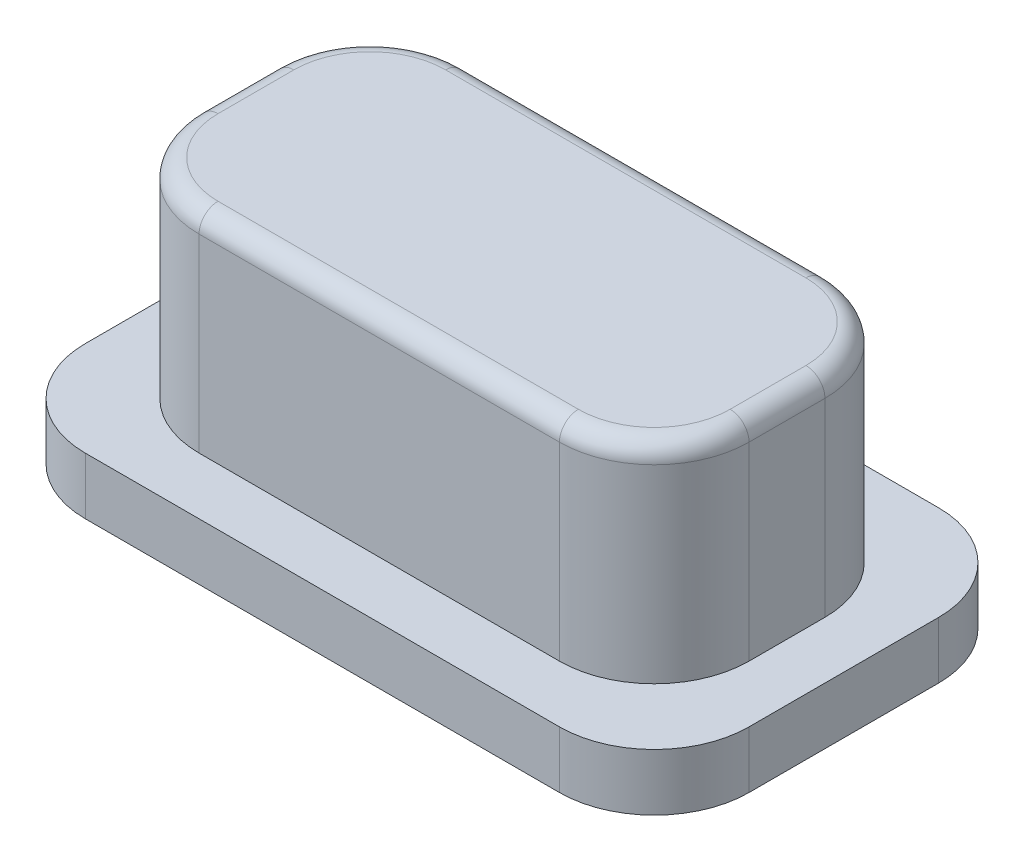
ISO-10303-21;
HEADER;
FILE_DESCRIPTION(('STEP AP214'),'2;1');
FILE_NAME('part.step','',(''),(''),'','','');
FILE_SCHEMA(('AUTOMOTIVE_DESIGN { 1 0 10303 214 1 1 1 1 }'));
ENDSEC;
DATA;
#1=APPLICATION_CONTEXT('core data for automotive mechanical design processes');
#2=APPLICATION_PROTOCOL_DEFINITION('international standard','automotive_design',2000,#1);
#3=PRODUCT_CONTEXT('',#1,'mechanical');
#4=PRODUCT('Part','Part','',(#3));
#5=PRODUCT_RELATED_PRODUCT_CATEGORY('part','',(#4));
#6=PRODUCT_DEFINITION_FORMATION('','',#4);
#7=PRODUCT_DEFINITION_CONTEXT('part definition',#1,'design');
#8=PRODUCT_DEFINITION('design','',#6,#7);
#9=PRODUCT_DEFINITION_SHAPE('','',#8);
#10=(LENGTH_UNIT() NAMED_UNIT(*) SI_UNIT(.MILLI.,.METRE.));
#11=(NAMED_UNIT(*) PLANE_ANGLE_UNIT() SI_UNIT($,.RADIAN.));
#12=(NAMED_UNIT(*) SI_UNIT($,.STERADIAN.) SOLID_ANGLE_UNIT());
#13=UNCERTAINTY_MEASURE_WITH_UNIT(LENGTH_MEASURE(1.E-05),#10,'distance_accuracy_value','');
#14=(GEOMETRIC_REPRESENTATION_CONTEXT(3) GLOBAL_UNCERTAINTY_ASSIGNED_CONTEXT((#13)) GLOBAL_UNIT_ASSIGNED_CONTEXT((#10,
#11,#12)) REPRESENTATION_CONTEXT('',''));
#15=CARTESIAN_POINT('',(0.,0.,0.));
#16=DIRECTION('',(0.,0.,1.));
#17=DIRECTION('',(1.,0.,0.));
#18=AXIS2_PLACEMENT_3D('',#15,#16,#17);
#19=CARTESIAN_POINT('',(0.,0.,0.));
#20=DIRECTION('',(0.,1.,0.));
#21=DIRECTION('',(0.,0.,1.));
#22=AXIS2_PLACEMENT_3D('',#19,#20,#21);
#23=PLANE('',#22);
#24=DIRECTION('',(-1.,0.,0.));
#25=VECTOR('',#24,1.);
#26=CARTESIAN_POINT('',(-2.50310695575245,0.,-1.76035479309902));
#27=LINE('',#26,#25);
#28=CARTESIAN_POINT('',(3.49689304424755,0.,-1.76035479309902));
#29=VERTEX_POINT('',#28);
#30=CARTESIAN_POINT('',(-1.50310695575245,0.,-1.76035479309902));
#31=VERTEX_POINT('',#30);
#32=EDGE_CURVE('E244',#29,#31,#27,.T.);
#33=ORIENTED_EDGE('',*,*,#32,.F.);
#34=CARTESIAN_POINT('',(3.49689304424755,0.,-0.760354793099017));
#35=DIRECTION('',(0.,1.,0.));
#36=DIRECTION('',(0.,0.,1.));
#37=AXIS2_PLACEMENT_3D('',#34,#35,#36);
#38=CIRCLE('',#37,1.);
#39=CARTESIAN_POINT('',(4.49689304424755,0.,-0.760354793099017));
#40=VERTEX_POINT('',#39);
#41=EDGE_CURVE('E274',#29,#40,#38,.F.);
#42=ORIENTED_EDGE('',*,*,#41,.T.);
#43=DIRECTION('',(0.,0.,-1.));
#44=VECTOR('',#43,1.);
#45=CARTESIAN_POINT('',(4.49689304424755,0.,-1.76035479309902));
#46=LINE('',#45,#44);
#47=CARTESIAN_POINT('',(4.49689304424755,0.,1.23964520690098));
#48=VERTEX_POINT('',#47);
#49=EDGE_CURVE('E259',#48,#40,#46,.T.);
#50=ORIENTED_EDGE('',*,*,#49,.F.);
#51=CARTESIAN_POINT('',(3.49689304424755,0.,1.23964520690098));
#52=DIRECTION('',(0.,1.,0.));
#53=DIRECTION('',(0.,0.,1.));
#54=AXIS2_PLACEMENT_3D('',#51,#52,#53);
#55=CIRCLE('',#54,1.);
#56=CARTESIAN_POINT('',(3.49689304424755,0.,2.23964520690098));
#57=VERTEX_POINT('',#56);
#58=EDGE_CURVE('E272',#48,#57,#55,.F.);
#59=ORIENTED_EDGE('',*,*,#58,.T.);
#60=DIRECTION('',(1.,0.,0.));
#61=VECTOR('',#60,1.);
#62=CARTESIAN_POINT('',(-2.50310695575245,0.,2.23964520690098));
#63=LINE('',#62,#61);
#64=CARTESIAN_POINT('',(-1.50310695575245,0.,2.23964520690098));
#65=VERTEX_POINT('',#64);
#66=EDGE_CURVE('E256',#65,#57,#63,.T.);
#67=ORIENTED_EDGE('',*,*,#66,.F.);
#68=CARTESIAN_POINT('',(-1.50310695575245,0.,1.23964520690098));
#69=DIRECTION('',(0.,1.,0.));
#70=DIRECTION('',(0.,0.,1.));
#71=AXIS2_PLACEMENT_3D('',#68,#69,#70);
#72=CIRCLE('',#71,1.);
#73=CARTESIAN_POINT('',(-2.50310695575245,0.,1.23964520690098));
#74=VERTEX_POINT('',#73);
#75=EDGE_CURVE('E268',#65,#74,#72,.F.);
#76=ORIENTED_EDGE('',*,*,#75,.T.);
#77=DIRECTION('',(0.,0.,1.));
#78=VECTOR('',#77,1.);
#79=CARTESIAN_POINT('',(-2.50310695575245,0.,-1.76035479309902));
#80=LINE('',#79,#78);
#81=CARTESIAN_POINT('',(-2.50310695575245,0.,-0.760354793099017));
#82=VERTEX_POINT('',#81);
#83=EDGE_CURVE('E239',#82,#74,#80,.T.);
#84=ORIENTED_EDGE('',*,*,#83,.F.);
#85=CARTESIAN_POINT('',(-1.50310695575245,0.,-0.760354793099017));
#86=DIRECTION('',(0.,1.,0.));
#87=DIRECTION('',(0.,0.,1.));
#88=AXIS2_PLACEMENT_3D('',#85,#86,#87);
#89=CIRCLE('',#88,1.);
#90=EDGE_CURVE('E270',#82,#31,#89,.F.);
#91=ORIENTED_EDGE('',*,*,#90,.T.);
#92=EDGE_LOOP('',(#33,#42,#50,#59,#67,#76,#84,#91));
#93=FACE_BOUND('',#92,.T.);
#94=DIRECTION('',(0.,0.,-1.));
#95=VECTOR('',#94,1.);
#96=CARTESIAN_POINT('',(-0.503106955752448,0.,-0.560354793099017));
#97=LINE('',#96,#95);
#98=CARTESIAN_POINT('',(-0.503106955752449,0.,1.03964520690098));
#99=VERTEX_POINT('',#98);
#100=CARTESIAN_POINT('',(-0.503106955752448,0.,-0.560354793099017));
#101=VERTEX_POINT('',#100);
#102=EDGE_CURVE('E221',#99,#101,#97,.T.);
#103=ORIENTED_EDGE('',*,*,#102,.F.);
#104=DIRECTION('',(-1.,0.,0.));
#105=VECTOR('',#104,1.);
#106=CARTESIAN_POINT('',(2.49689304424755,0.,1.03964520690098));
#107=LINE('',#106,#105);
#108=CARTESIAN_POINT('',(2.49689304424755,0.,1.03964520690098));
#109=VERTEX_POINT('',#108);
#110=EDGE_CURVE('E218',#109,#99,#107,.T.);
#111=ORIENTED_EDGE('',*,*,#110,.F.);
#112=DIRECTION('',(0.,0.,1.));
#113=VECTOR('',#112,1.);
#114=CARTESIAN_POINT('',(2.49689304424755,0.,-0.560354793099017));
#115=LINE('',#114,#113);
#116=CARTESIAN_POINT('',(2.49689304424755,0.,-0.560354793099017));
#117=VERTEX_POINT('',#116);
#118=EDGE_CURVE('E382',#117,#109,#115,.T.);
#119=ORIENTED_EDGE('',*,*,#118,.F.);
#120=DIRECTION('',(1.,0.,0.));
#121=VECTOR('',#120,1.);
#122=CARTESIAN_POINT('',(2.49689304424755,0.,-0.560354793099017));
#123=LINE('',#122,#121);
#124=EDGE_CURVE('E380',#101,#117,#123,.T.);
#125=ORIENTED_EDGE('',*,*,#124,.F.);
#126=EDGE_LOOP('',(#103,#111,#119,#125));
#127=FACE_BOUND('',#126,.T.);
#128=ADVANCED_FACE('F34',(#93,#127),#23,.F.);
#129=CARTESIAN_POINT('',(-2.50310695575245,0.6,-1.76035479309902));
#130=DIRECTION('',(1.,0.,0.));
#131=DIRECTION('',(0.,0.,-1.));
#132=AXIS2_PLACEMENT_3D('',#129,#130,#131);
#133=PLANE('',#132);
#134=DIRECTION('',(0.,0.,1.));
#135=VECTOR('',#134,1.);
#136=CARTESIAN_POINT('',(-2.50310695575245,0.6,-1.76035479309902));
#137=LINE('',#136,#135);
#138=CARTESIAN_POINT('',(-2.50310695575245,0.6,-0.760354793099017));
#139=VERTEX_POINT('',#138);
#140=CARTESIAN_POINT('',(-2.50310695575245,0.6,1.23964520690098));
#141=VERTEX_POINT('',#140);
#142=EDGE_CURVE('E240',#139,#141,#137,.T.);
#143=ORIENTED_EDGE('',*,*,#142,.F.);
#144=DIRECTION('',(0.,-1.,0.));
#145=VECTOR('',#144,1.);
#146=CARTESIAN_POINT('',(-2.50310695575245,0.6,-0.760354793099017));
#147=LINE('',#146,#145);
#148=EDGE_CURVE('E296',#139,#82,#147,.T.);
#149=ORIENTED_EDGE('',*,*,#148,.T.);
#150=ORIENTED_EDGE('',*,*,#83,.T.);
#151=DIRECTION('',(0.,-1.,0.));
#152=VECTOR('',#151,1.);
#153=CARTESIAN_POINT('',(-2.50310695575245,0.6,1.23964520690098));
#154=LINE('',#153,#152);
#155=EDGE_CURVE('E294',#74,#141,#154,.F.);
#156=ORIENTED_EDGE('',*,*,#155,.T.);
#157=EDGE_LOOP('',(#143,#149,#150,#156));
#158=FACE_BOUND('',#157,.T.);
#159=ADVANCED_FACE('F400',(#158),#133,.F.);
#160=CARTESIAN_POINT('',(-2.50310695575245,0.6,2.23964520690098));
#161=DIRECTION('',(0.,0.,-1.));
#162=DIRECTION('',(-1.,0.,0.));
#163=AXIS2_PLACEMENT_3D('',#160,#161,#162);
#164=PLANE('',#163);
#165=ORIENTED_EDGE('',*,*,#66,.T.);
#166=DIRECTION('',(0.,-1.,0.));
#167=VECTOR('',#166,1.);
#168=CARTESIAN_POINT('',(3.49689304424755,0.6,2.23964520690098));
#169=LINE('',#168,#167);
#170=CARTESIAN_POINT('',(3.49689304424755,0.6,2.23964520690098));
#171=VERTEX_POINT('',#170);
#172=EDGE_CURVE('E292',#57,#171,#169,.F.);
#173=ORIENTED_EDGE('',*,*,#172,.T.);
#174=DIRECTION('',(1.,0.,0.));
#175=VECTOR('',#174,1.);
#176=CARTESIAN_POINT('',(-2.50310695575245,0.6,2.23964520690098));
#177=LINE('',#176,#175);
#178=CARTESIAN_POINT('',(-1.50310695575245,0.6,2.23964520690098));
#179=VERTEX_POINT('',#178);
#180=EDGE_CURVE('E243',#179,#171,#177,.T.);
#181=ORIENTED_EDGE('',*,*,#180,.F.);
#182=DIRECTION('',(0.,-1.,0.));
#183=VECTOR('',#182,1.);
#184=CARTESIAN_POINT('',(-1.50310695575245,0.6,2.23964520690098));
#185=LINE('',#184,#183);
#186=EDGE_CURVE('E289',#179,#65,#185,.T.);
#187=ORIENTED_EDGE('',*,*,#186,.T.);
#188=EDGE_LOOP('',(#165,#173,#181,#187));
#189=FACE_BOUND('',#188,.T.);
#190=ADVANCED_FACE('F406',(#189),#164,.F.);
#191=CARTESIAN_POINT('',(4.49689304424755,0.6,-1.76035479309902));
#192=DIRECTION('',(-1.,0.,0.));
#193=DIRECTION('',(0.,0.,1.));
#194=AXIS2_PLACEMENT_3D('',#191,#192,#193);
#195=PLANE('',#194);
#196=ORIENTED_EDGE('',*,*,#49,.T.);
#197=DIRECTION('',(0.,-1.,0.));
#198=VECTOR('',#197,1.);
#199=CARTESIAN_POINT('',(4.49689304424755,0.6,-0.760354793099017));
#200=LINE('',#199,#198);
#201=CARTESIAN_POINT('',(4.49689304424755,0.6,-0.760354793099017));
#202=VERTEX_POINT('',#201);
#203=EDGE_CURVE('E279',#40,#202,#200,.F.);
#204=ORIENTED_EDGE('',*,*,#203,.T.);
#205=DIRECTION('',(0.,0.,-1.));
#206=VECTOR('',#205,1.);
#207=CARTESIAN_POINT('',(4.49689304424755,0.6,-1.76035479309902));
#208=LINE('',#207,#206);
#209=CARTESIAN_POINT('',(4.49689304424755,0.6,1.23964520690098));
#210=VERTEX_POINT('',#209);
#211=EDGE_CURVE('E247',#210,#202,#208,.T.);
#212=ORIENTED_EDGE('',*,*,#211,.F.);
#213=DIRECTION('',(0.,-1.,0.));
#214=VECTOR('',#213,1.);
#215=CARTESIAN_POINT('',(4.49689304424755,0.6,1.23964520690098));
#216=LINE('',#215,#214);
#217=EDGE_CURVE('E276',#210,#48,#216,.T.);
#218=ORIENTED_EDGE('',*,*,#217,.T.);
#219=EDGE_LOOP('',(#196,#204,#212,#218));
#220=FACE_BOUND('',#219,.T.);
#221=ADVANCED_FACE('F417',(#220),#195,.F.);
#222=CARTESIAN_POINT('',(-2.50310695575245,0.6,-1.76035479309902));
#223=DIRECTION('',(0.,0.,1.));
#224=DIRECTION('',(1.,0.,0.));
#225=AXIS2_PLACEMENT_3D('',#222,#223,#224);
#226=PLANE('',#225);
#227=DIRECTION('',(-1.,0.,0.));
#228=VECTOR('',#227,1.);
#229=CARTESIAN_POINT('',(-2.50310695575245,0.6,-1.76035479309902));
#230=LINE('',#229,#228);
#231=CARTESIAN_POINT('',(3.49689304424755,0.6,-1.76035479309902));
#232=VERTEX_POINT('',#231);
#233=CARTESIAN_POINT('',(-1.50310695575245,0.6,-1.76035479309902));
#234=VERTEX_POINT('',#233);
#235=EDGE_CURVE('E250',#232,#234,#230,.T.);
#236=ORIENTED_EDGE('',*,*,#235,.F.);
#237=DIRECTION('',(0.,-1.,0.));
#238=VECTOR('',#237,1.);
#239=CARTESIAN_POINT('',(3.49689304424755,0.6,-1.76035479309902));
#240=LINE('',#239,#238);
#241=EDGE_CURVE('E265',#232,#29,#240,.T.);
#242=ORIENTED_EDGE('',*,*,#241,.T.);
#243=ORIENTED_EDGE('',*,*,#32,.T.);
#244=DIRECTION('',(0.,-1.,0.));
#245=VECTOR('',#244,1.);
#246=CARTESIAN_POINT('',(-1.50310695575245,0.6,-1.76035479309902));
#247=LINE('',#246,#245);
#248=EDGE_CURVE('E253',#31,#234,#247,.F.);
#249=ORIENTED_EDGE('',*,*,#248,.T.);
#250=EDGE_LOOP('',(#236,#242,#243,#249));
#251=FACE_BOUND('',#250,.T.);
#252=ADVANCED_FACE('F414',(#251),#226,.F.);
#253=CARTESIAN_POINT('',(0.,0.6,0.));
#254=DIRECTION('',(0.,1.,0.));
#255=DIRECTION('',(0.,0.,1.));
#256=AXIS2_PLACEMENT_3D('',#253,#254,#255);
#257=PLANE('',#256);
#258=DIRECTION('',(0.,0.,-1.));
#259=VECTOR('',#258,1.);
#260=CARTESIAN_POINT('',(3.89689304424755,0.6,-1.16035479309902));
#261=LINE('',#260,#259);
#262=CARTESIAN_POINT('',(3.89689304424755,0.6,0.639645206900983));
#263=VERTEX_POINT('',#262);
#264=CARTESIAN_POINT('',(3.89689304424755,0.6,-0.160354793099017));
#265=VERTEX_POINT('',#264);
#266=EDGE_CURVE('E222',#263,#265,#261,.T.);
#267=ORIENTED_EDGE('',*,*,#266,.F.);
#268=CARTESIAN_POINT('',(2.89689304424755,0.6,0.639645206900983));
#269=DIRECTION('',(0.,1.,0.));
#270=DIRECTION('',(0.,0.,1.));
#271=AXIS2_PLACEMENT_3D('',#268,#269,#270);
#272=CIRCLE('',#271,1.);
#273=CARTESIAN_POINT('',(2.89689304424755,0.6,1.63964520690098));
#274=VERTEX_POINT('',#273);
#275=EDGE_CURVE('E323',#263,#274,#272,.F.);
#276=ORIENTED_EDGE('',*,*,#275,.T.);
#277=DIRECTION('',(1.,0.,0.));
#278=VECTOR('',#277,1.);
#279=CARTESIAN_POINT('',(-1.90310695575245,0.6,1.63964520690098));
#280=LINE('',#279,#278);
#281=CARTESIAN_POINT('',(-0.903106955752448,0.6,1.63964520690098));
#282=VERTEX_POINT('',#281);
#283=EDGE_CURVE('E236',#282,#274,#280,.T.);
#284=ORIENTED_EDGE('',*,*,#283,.F.);
#285=CARTESIAN_POINT('',(-0.903106955752448,0.6,0.639645206900983));
#286=DIRECTION('',(0.,1.,0.));
#287=DIRECTION('',(0.,0.,1.));
#288=AXIS2_PLACEMENT_3D('',#285,#286,#287);
#289=CIRCLE('',#288,1.);
#290=CARTESIAN_POINT('',(-1.90310695575245,0.6,0.639645206900983));
#291=VERTEX_POINT('',#290);
#292=EDGE_CURVE('E321',#282,#291,#289,.F.);
#293=ORIENTED_EDGE('',*,*,#292,.T.);
#294=DIRECTION('',(0.,0.,1.));
#295=VECTOR('',#294,1.);
#296=CARTESIAN_POINT('',(-1.90310695575245,0.6,-1.16035479309902));
#297=LINE('',#296,#295);
#298=CARTESIAN_POINT('',(-1.90310695575245,0.6,-0.160354793099017));
#299=VERTEX_POINT('',#298);
#300=EDGE_CURVE('E233',#299,#291,#297,.T.);
#301=ORIENTED_EDGE('',*,*,#300,.F.);
#302=CARTESIAN_POINT('',(-0.903106955752448,0.6,-0.160354793099017));
#303=DIRECTION('',(0.,1.,0.));
#304=DIRECTION('',(0.,0.,1.));
#305=AXIS2_PLACEMENT_3D('',#302,#303,#304);
#306=CIRCLE('',#305,1.);
#307=CARTESIAN_POINT('',(-0.903106955752448,0.6,-1.16035479309902));
#308=VERTEX_POINT('',#307);
#309=EDGE_CURVE('E319',#299,#308,#306,.F.);
#310=ORIENTED_EDGE('',*,*,#309,.T.);
#311=DIRECTION('',(-1.,0.,0.));
#312=VECTOR('',#311,1.);
#313=CARTESIAN_POINT('',(-1.90310695575245,0.6,-1.16035479309902));
#314=LINE('',#313,#312);
#315=CARTESIAN_POINT('',(2.89689304424755,0.6,-1.16035479309902));
#316=VERTEX_POINT('',#315);
#317=EDGE_CURVE('E225',#316,#308,#314,.T.);
#318=ORIENTED_EDGE('',*,*,#317,.F.);
#319=CARTESIAN_POINT('',(2.89689304424755,0.6,-0.160354793099017));
#320=DIRECTION('',(0.,1.,0.));
#321=DIRECTION('',(0.,0.,1.));
#322=AXIS2_PLACEMENT_3D('',#319,#320,#321);
#323=CIRCLE('',#322,1.);
#324=EDGE_CURVE('E317',#316,#265,#323,.F.);
#325=ORIENTED_EDGE('',*,*,#324,.T.);
#326=EDGE_LOOP('',(#267,#276,#284,#293,#301,#310,#318,#325));
#327=FACE_BOUND('',#326,.T.);
#328=ORIENTED_EDGE('',*,*,#211,.T.);
#329=CARTESIAN_POINT('',(3.49689304424755,0.6,-0.760354793099017));
#330=DIRECTION('',(0.,1.,0.));
#331=DIRECTION('',(0.,0.,1.));
#332=AXIS2_PLACEMENT_3D('',#329,#330,#331);
#333=CIRCLE('',#332,1.);
#334=EDGE_CURVE('E287',#202,#232,#333,.T.);
#335=ORIENTED_EDGE('',*,*,#334,.T.);
#336=ORIENTED_EDGE('',*,*,#235,.T.);
#337=CARTESIAN_POINT('',(-1.50310695575245,0.6,-0.760354793099017));
#338=DIRECTION('',(0.,1.,0.));
#339=DIRECTION('',(0.,0.,1.));
#340=AXIS2_PLACEMENT_3D('',#337,#338,#339);
#341=CIRCLE('',#340,1.);
#342=EDGE_CURVE('E283',#234,#139,#341,.T.);
#343=ORIENTED_EDGE('',*,*,#342,.T.);
#344=ORIENTED_EDGE('',*,*,#142,.T.);
#345=CARTESIAN_POINT('',(-1.50310695575245,0.6,1.23964520690098));
#346=DIRECTION('',(0.,1.,0.));
#347=DIRECTION('',(0.,0.,1.));
#348=AXIS2_PLACEMENT_3D('',#345,#346,#347);
#349=CIRCLE('',#348,1.);
#350=EDGE_CURVE('E281',#141,#179,#349,.T.);
#351=ORIENTED_EDGE('',*,*,#350,.T.);
#352=ORIENTED_EDGE('',*,*,#180,.T.);
#353=CARTESIAN_POINT('',(3.49689304424755,0.6,1.23964520690098));
#354=DIRECTION('',(0.,1.,0.));
#355=DIRECTION('',(0.,0.,1.));
#356=AXIS2_PLACEMENT_3D('',#353,#354,#355);
#357=CIRCLE('',#356,1.);
#358=EDGE_CURVE('E285',#171,#210,#357,.T.);
#359=ORIENTED_EDGE('',*,*,#358,.T.);
#360=EDGE_LOOP('',(#328,#335,#336,#343,#344,#351,#352,#359));
#361=FACE_BOUND('',#360,.T.);
#362=ADVANCED_FACE('F412',(#327,#361),#257,.T.);
#363=CARTESIAN_POINT('',(3.89689304424755,2.8,-1.16035479309902));
#364=DIRECTION('',(-1.,0.,0.));
#365=DIRECTION('',(0.,0.,1.));
#366=AXIS2_PLACEMENT_3D('',#363,#364,#365);
#367=PLANE('',#366);
#368=DIRECTION('',(0.,-1.,0.));
#369=VECTOR('',#368,1.);
#370=CARTESIAN_POINT('',(3.89689304424755,2.8,-0.160354793099017));
#371=LINE('',#370,#369);
#372=CARTESIAN_POINT('',(3.89689304424755,2.6,-0.160354793099017));
#373=VERTEX_POINT('',#372);
#374=EDGE_CURVE('E305',#265,#373,#371,.F.);
#375=ORIENTED_EDGE('',*,*,#374,.T.);
#376=DIRECTION('',(0.,0.,-1.));
#377=VECTOR('',#376,1.);
#378=CARTESIAN_POINT('',(3.89689304424755,2.6,0.639645206900983));
#379=LINE('',#378,#377);
#380=CARTESIAN_POINT('',(3.89689304424755,2.6,0.639645206900983));
#381=VERTEX_POINT('',#380);
#382=EDGE_CURVE('E11',#373,#381,#379,.F.);
#383=ORIENTED_EDGE('',*,*,#382,.T.);
#384=DIRECTION('',(0.,-1.,0.));
#385=VECTOR('',#384,1.);
#386=CARTESIAN_POINT('',(3.89689304424755,2.8,0.639645206900983));
#387=LINE('',#386,#385);
#388=EDGE_CURVE('E303',#381,#263,#387,.T.);
#389=ORIENTED_EDGE('',*,*,#388,.T.);
#390=ORIENTED_EDGE('',*,*,#266,.T.);
#391=EDGE_LOOP('',(#375,#383,#389,#390));
#392=FACE_BOUND('',#391,.T.);
#393=ADVANCED_FACE('F499',(#392),#367,.F.);
#394=CARTESIAN_POINT('',(-1.90310695575245,2.8,-1.16035479309902));
#395=DIRECTION('',(0.,0.,1.));
#396=DIRECTION('',(1.,0.,0.));
#397=AXIS2_PLACEMENT_3D('',#394,#395,#396);
#398=PLANE('',#397);
#399=DIRECTION('',(0.,-1.,0.));
#400=VECTOR('',#399,1.);
#401=CARTESIAN_POINT('',(-0.903106955752448,2.8,-1.16035479309902));
#402=LINE('',#401,#400);
#403=CARTESIAN_POINT('',(-0.903106955752448,2.6,-1.16035479309902));
#404=VERTEX_POINT('',#403);
#405=EDGE_CURVE('E299',#308,#404,#402,.F.);
#406=ORIENTED_EDGE('',*,*,#405,.T.);
#407=DIRECTION('',(-1.,0.,0.));
#408=VECTOR('',#407,1.);
#409=CARTESIAN_POINT('',(2.89689304424755,2.6,-1.16035479309902));
#410=LINE('',#409,#408);
#411=CARTESIAN_POINT('',(2.89689304424755,2.6,-1.16035479309902));
#412=VERTEX_POINT('',#411);
#413=EDGE_CURVE('E58',#404,#412,#410,.F.);
#414=ORIENTED_EDGE('',*,*,#413,.T.);
#415=DIRECTION('',(0.,-1.,0.));
#416=VECTOR('',#415,1.);
#417=CARTESIAN_POINT('',(2.89689304424755,2.8,-1.16035479309902));
#418=LINE('',#417,#416);
#419=EDGE_CURVE('E301',#412,#316,#418,.T.);
#420=ORIENTED_EDGE('',*,*,#419,.T.);
#421=ORIENTED_EDGE('',*,*,#317,.T.);
#422=EDGE_LOOP('',(#406,#414,#420,#421));
#423=FACE_BOUND('',#422,.T.);
#424=ADVANCED_FACE('F528',(#423),#398,.F.);
#425=CARTESIAN_POINT('',(-1.90310695575245,2.8,-1.16035479309902));
#426=DIRECTION('',(1.,0.,0.));
#427=DIRECTION('',(0.,0.,-1.));
#428=AXIS2_PLACEMENT_3D('',#425,#426,#427);
#429=PLANE('',#428);
#430=DIRECTION('',(0.,-1.,0.));
#431=VECTOR('',#430,1.);
#432=CARTESIAN_POINT('',(-1.90310695575245,2.8,0.639645206900983));
#433=LINE('',#432,#431);
#434=CARTESIAN_POINT('',(-1.90310695575245,2.6,0.639645206900983));
#435=VERTEX_POINT('',#434);
#436=EDGE_CURVE('E307',#291,#435,#433,.F.);
#437=ORIENTED_EDGE('',*,*,#436,.T.);
#438=DIRECTION('',(0.,0.,1.));
#439=VECTOR('',#438,1.);
#440=CARTESIAN_POINT('',(-1.90310695575245,2.6,-0.160354793099017));
#441=LINE('',#440,#439);
#442=CARTESIAN_POINT('',(-1.90310695575245,2.6,-0.160354793099017));
#443=VERTEX_POINT('',#442);
#444=EDGE_CURVE('E349',#435,#443,#441,.F.);
#445=ORIENTED_EDGE('',*,*,#444,.T.);
#446=DIRECTION('',(0.,-1.,0.));
#447=VECTOR('',#446,1.);
#448=CARTESIAN_POINT('',(-1.90310695575245,2.8,-0.160354793099017));
#449=LINE('',#448,#447);
#450=EDGE_CURVE('E310',#443,#299,#449,.T.);
#451=ORIENTED_EDGE('',*,*,#450,.T.);
#452=ORIENTED_EDGE('',*,*,#300,.T.);
#453=EDGE_LOOP('',(#437,#445,#451,#452));
#454=FACE_BOUND('',#453,.T.);
#455=ADVANCED_FACE('F520',(#454),#429,.F.);
#456=CARTESIAN_POINT('',(-1.90310695575245,2.8,1.63964520690098));
#457=DIRECTION('',(0.,0.,-1.));
#458=DIRECTION('',(-1.,0.,0.));
#459=AXIS2_PLACEMENT_3D('',#456,#457,#458);
#460=PLANE('',#459);
#461=DIRECTION('',(0.,-1.,0.));
#462=VECTOR('',#461,1.);
#463=CARTESIAN_POINT('',(2.89689304424755,2.8,1.63964520690098));
#464=LINE('',#463,#462);
#465=CARTESIAN_POINT('',(2.89689304424755,2.6,1.63964520690098));
#466=VERTEX_POINT('',#465);
#467=EDGE_CURVE('E312',#274,#466,#464,.F.);
#468=ORIENTED_EDGE('',*,*,#467,.T.);
#469=DIRECTION('',(1.,0.,0.));
#470=VECTOR('',#469,1.);
#471=CARTESIAN_POINT('',(-0.903106955752448,2.6,1.63964520690098));
#472=LINE('',#471,#470);
#473=CARTESIAN_POINT('',(-0.903106955752448,2.6,1.63964520690098));
#474=VERTEX_POINT('',#473);
#475=EDGE_CURVE('E345',#466,#474,#472,.F.);
#476=ORIENTED_EDGE('',*,*,#475,.T.);
#477=DIRECTION('',(0.,-1.,0.));
#478=VECTOR('',#477,1.);
#479=CARTESIAN_POINT('',(-0.903106955752448,2.8,1.63964520690098));
#480=LINE('',#479,#478);
#481=EDGE_CURVE('E315',#474,#282,#480,.T.);
#482=ORIENTED_EDGE('',*,*,#481,.T.);
#483=ORIENTED_EDGE('',*,*,#283,.T.);
#484=EDGE_LOOP('',(#468,#476,#482,#483));
#485=FACE_BOUND('',#484,.T.);
#486=ADVANCED_FACE('F511',(#485),#460,.F.);
#487=CARTESIAN_POINT('',(0.,2.8,0.));
#488=DIRECTION('',(0.,1.,0.));
#489=DIRECTION('',(0.,0.,1.));
#490=AXIS2_PLACEMENT_3D('',#487,#488,#489);
#491=PLANE('',#490);
#492=DIRECTION('',(1.,0.,0.));
#493=VECTOR('',#492,1.);
#494=CARTESIAN_POINT('',(2.89689304424755,2.8,1.43964520690098));
#495=LINE('',#494,#493);
#496=CARTESIAN_POINT('',(-0.903106955752448,2.8,1.43964520690098));
#497=VERTEX_POINT('',#496);
#498=CARTESIAN_POINT('',(2.89689304424755,2.8,1.43964520690098));
#499=VERTEX_POINT('',#498);
#500=EDGE_CURVE('E337',#497,#499,#495,.T.);
#501=ORIENTED_EDGE('',*,*,#500,.T.);
#502=CARTESIAN_POINT('',(2.89689304424755,2.8,0.639645206900983));
#503=DIRECTION('',(0.,1.,0.));
#504=DIRECTION('',(0.,0.,1.));
#505=AXIS2_PLACEMENT_3D('',#502,#503,#504);
#506=CIRCLE('',#505,0.8);
#507=CARTESIAN_POINT('',(3.69689304424755,2.8,0.639645206900983));
#508=VERTEX_POINT('',#507);
#509=EDGE_CURVE('E339',#499,#508,#506,.T.);
#510=ORIENTED_EDGE('',*,*,#509,.T.);
#511=DIRECTION('',(0.,0.,-1.));
#512=VECTOR('',#511,1.);
#513=CARTESIAN_POINT('',(3.69689304424755,2.8,-0.160354793099017));
#514=LINE('',#513,#512);
#515=CARTESIAN_POINT('',(3.69689304424755,2.8,-0.160354793099017));
#516=VERTEX_POINT('',#515);
#517=EDGE_CURVE('E325',#508,#516,#514,.T.);
#518=ORIENTED_EDGE('',*,*,#517,.T.);
#519=CARTESIAN_POINT('',(2.89689304424755,2.8,-0.160354793099017));
#520=DIRECTION('',(0.,1.,0.));
#521=DIRECTION('',(0.,0.,1.));
#522=AXIS2_PLACEMENT_3D('',#519,#520,#521);
#523=CIRCLE('',#522,0.8);
#524=CARTESIAN_POINT('',(2.89689304424755,2.8,-0.960354793099017));
#525=VERTEX_POINT('',#524);
#526=EDGE_CURVE('E327',#516,#525,#523,.T.);
#527=ORIENTED_EDGE('',*,*,#526,.T.);
#528=DIRECTION('',(-1.,0.,0.));
#529=VECTOR('',#528,1.);
#530=CARTESIAN_POINT('',(-0.903106955752448,2.8,-0.960354793099017));
#531=LINE('',#530,#529);
#532=CARTESIAN_POINT('',(-0.903106955752448,2.8,-0.960354793099017));
#533=VERTEX_POINT('',#532);
#534=EDGE_CURVE('E329',#525,#533,#531,.T.);
#535=ORIENTED_EDGE('',*,*,#534,.T.);
#536=CARTESIAN_POINT('',(-0.903106955752448,2.8,-0.160354793099017));
#537=DIRECTION('',(0.,1.,0.));
#538=DIRECTION('',(0.,0.,1.));
#539=AXIS2_PLACEMENT_3D('',#536,#537,#538);
#540=CIRCLE('',#539,0.8);
#541=CARTESIAN_POINT('',(-1.70310695575245,2.8,-0.160354793099017));
#542=VERTEX_POINT('',#541);
#543=EDGE_CURVE('E331',#533,#542,#540,.T.);
#544=ORIENTED_EDGE('',*,*,#543,.T.);
#545=DIRECTION('',(0.,0.,1.));
#546=VECTOR('',#545,1.);
#547=CARTESIAN_POINT('',(-1.70310695575245,2.8,0.639645206900983));
#548=LINE('',#547,#546);
#549=CARTESIAN_POINT('',(-1.70310695575245,2.8,0.639645206900983));
#550=VERTEX_POINT('',#549);
#551=EDGE_CURVE('E333',#542,#550,#548,.T.);
#552=ORIENTED_EDGE('',*,*,#551,.T.);
#553=CARTESIAN_POINT('',(-0.903106955752448,2.8,0.639645206900983));
#554=DIRECTION('',(0.,1.,0.));
#555=DIRECTION('',(0.,0.,1.));
#556=AXIS2_PLACEMENT_3D('',#553,#554,#555);
#557=CIRCLE('',#556,0.8);
#558=EDGE_CURVE('E335',#550,#497,#557,.T.);
#559=ORIENTED_EDGE('',*,*,#558,.T.);
#560=EDGE_LOOP('',(#501,#510,#518,#527,#535,#544,#552,#559));
#561=FACE_BOUND('',#560,.T.);
#562=ADVANCED_FACE('F429',(#561),#491,.T.);
#563=CARTESIAN_POINT('',(3.49689304424755,0.6,-0.760354793099017));
#564=DIRECTION('',(0.,-1.,0.));
#565=DIRECTION('',(0.,0.,-1.));
#566=AXIS2_PLACEMENT_3D('',#563,#564,#565);
#567=CYLINDRICAL_SURFACE('',#566,1.);
#568=ORIENTED_EDGE('',*,*,#334,.F.);
#569=ORIENTED_EDGE('',*,*,#203,.F.);
#570=ORIENTED_EDGE('',*,*,#41,.F.);
#571=ORIENTED_EDGE('',*,*,#241,.F.);
#572=EDGE_LOOP('',(#568,#569,#570,#571));
#573=FACE_BOUND('',#572,.T.);
#574=ADVANCED_FACE('F425',(#573),#567,.T.);
#575=CARTESIAN_POINT('',(3.49689304424755,0.6,1.23964520690098));
#576=DIRECTION('',(0.,-1.,0.));
#577=DIRECTION('',(0.,0.,-1.));
#578=AXIS2_PLACEMENT_3D('',#575,#576,#577);
#579=CYLINDRICAL_SURFACE('',#578,1.);
#580=ORIENTED_EDGE('',*,*,#358,.F.);
#581=ORIENTED_EDGE('',*,*,#172,.F.);
#582=ORIENTED_EDGE('',*,*,#58,.F.);
#583=ORIENTED_EDGE('',*,*,#217,.F.);
#584=EDGE_LOOP('',(#580,#581,#582,#583));
#585=FACE_BOUND('',#584,.T.);
#586=ADVANCED_FACE('F428',(#585),#579,.T.);
#587=CARTESIAN_POINT('',(-1.50310695575245,0.6,-0.760354793099017));
#588=DIRECTION('',(0.,-1.,0.));
#589=DIRECTION('',(0.,0.,-1.));
#590=AXIS2_PLACEMENT_3D('',#587,#588,#589);
#591=CYLINDRICAL_SURFACE('',#590,1.);
#592=ORIENTED_EDGE('',*,*,#342,.F.);
#593=ORIENTED_EDGE('',*,*,#248,.F.);
#594=ORIENTED_EDGE('',*,*,#90,.F.);
#595=ORIENTED_EDGE('',*,*,#148,.F.);
#596=EDGE_LOOP('',(#592,#593,#594,#595));
#597=FACE_BOUND('',#596,.T.);
#598=ADVANCED_FACE('F433',(#597),#591,.T.);
#599=CARTESIAN_POINT('',(-1.50310695575245,0.6,1.23964520690098));
#600=DIRECTION('',(0.,-1.,0.));
#601=DIRECTION('',(0.,0.,-1.));
#602=AXIS2_PLACEMENT_3D('',#599,#600,#601);
#603=CYLINDRICAL_SURFACE('',#602,1.);
#604=ORIENTED_EDGE('',*,*,#350,.F.);
#605=ORIENTED_EDGE('',*,*,#155,.F.);
#606=ORIENTED_EDGE('',*,*,#75,.F.);
#607=ORIENTED_EDGE('',*,*,#186,.F.);
#608=EDGE_LOOP('',(#604,#605,#606,#607));
#609=FACE_BOUND('',#608,.T.);
#610=ADVANCED_FACE('F437',(#609),#603,.T.);
#611=CARTESIAN_POINT('',(2.89689304424755,2.8,-0.160354793099017));
#612=DIRECTION('',(0.,-1.,0.));
#613=DIRECTION('',(0.,0.,-1.));
#614=AXIS2_PLACEMENT_3D('',#611,#612,#613);
#615=CYLINDRICAL_SURFACE('',#614,1.);
#616=ORIENTED_EDGE('',*,*,#419,.F.);
#617=CARTESIAN_POINT('',(2.89689304424755,2.6,-0.160354793099017));
#618=DIRECTION('',(0.,1.,0.));
#619=DIRECTION('',(0.,0.,1.));
#620=AXIS2_PLACEMENT_3D('',#617,#618,#619);
#621=CIRCLE('',#620,1.);
#622=EDGE_CURVE('E43',#412,#373,#621,.F.);
#623=ORIENTED_EDGE('',*,*,#622,.T.);
#624=ORIENTED_EDGE('',*,*,#374,.F.);
#625=ORIENTED_EDGE('',*,*,#324,.F.);
#626=EDGE_LOOP('',(#616,#623,#624,#625));
#627=FACE_BOUND('',#626,.T.);
#628=ADVANCED_FACE('F441',(#627),#615,.T.);
#629=CARTESIAN_POINT('',(-0.903106955752448,2.8,-0.160354793099017));
#630=DIRECTION('',(0.,-1.,0.));
#631=DIRECTION('',(0.,0.,-1.));
#632=AXIS2_PLACEMENT_3D('',#629,#630,#631);
#633=CYLINDRICAL_SURFACE('',#632,1.);
#634=ORIENTED_EDGE('',*,*,#450,.F.);
#635=CARTESIAN_POINT('',(-0.903106955752448,2.6,-0.160354793099017));
#636=DIRECTION('',(0.,1.,0.));
#637=DIRECTION('',(0.,0.,1.));
#638=AXIS2_PLACEMENT_3D('',#635,#636,#637);
#639=CIRCLE('',#638,1.);
#640=EDGE_CURVE('E351',#443,#404,#639,.F.);
#641=ORIENTED_EDGE('',*,*,#640,.T.);
#642=ORIENTED_EDGE('',*,*,#405,.F.);
#643=ORIENTED_EDGE('',*,*,#309,.F.);
#644=EDGE_LOOP('',(#634,#641,#642,#643));
#645=FACE_BOUND('',#644,.T.);
#646=ADVANCED_FACE('F445',(#645),#633,.T.);
#647=CARTESIAN_POINT('',(-0.903106955752448,2.8,0.639645206900983));
#648=DIRECTION('',(0.,-1.,0.));
#649=DIRECTION('',(0.,0.,-1.));
#650=AXIS2_PLACEMENT_3D('',#647,#648,#649);
#651=CYLINDRICAL_SURFACE('',#650,1.);
#652=ORIENTED_EDGE('',*,*,#481,.F.);
#653=CARTESIAN_POINT('',(-0.903106955752448,2.6,0.639645206900983));
#654=DIRECTION('',(0.,1.,0.));
#655=DIRECTION('',(0.,0.,1.));
#656=AXIS2_PLACEMENT_3D('',#653,#654,#655);
#657=CIRCLE('',#656,1.);
#658=EDGE_CURVE('E347',#474,#435,#657,.F.);
#659=ORIENTED_EDGE('',*,*,#658,.T.);
#660=ORIENTED_EDGE('',*,*,#436,.F.);
#661=ORIENTED_EDGE('',*,*,#292,.F.);
#662=EDGE_LOOP('',(#652,#659,#660,#661));
#663=FACE_BOUND('',#662,.T.);
#664=ADVANCED_FACE('F448',(#663),#651,.T.);
#665=CARTESIAN_POINT('',(2.89689304424755,2.8,0.639645206900983));
#666=DIRECTION('',(0.,-1.,0.));
#667=DIRECTION('',(0.,0.,-1.));
#668=AXIS2_PLACEMENT_3D('',#665,#666,#667);
#669=CYLINDRICAL_SURFACE('',#668,1.);
#670=ORIENTED_EDGE('',*,*,#388,.F.);
#671=CARTESIAN_POINT('',(2.89689304424755,2.6,0.639645206900983));
#672=DIRECTION('',(0.,1.,0.));
#673=DIRECTION('',(0.,0.,1.));
#674=AXIS2_PLACEMENT_3D('',#671,#672,#673);
#675=CIRCLE('',#674,1.);
#676=EDGE_CURVE('E342',#381,#466,#675,.F.);
#677=ORIENTED_EDGE('',*,*,#676,.T.);
#678=ORIENTED_EDGE('',*,*,#467,.F.);
#679=ORIENTED_EDGE('',*,*,#275,.F.);
#680=EDGE_LOOP('',(#670,#677,#678,#679));
#681=FACE_BOUND('',#680,.T.);
#682=ADVANCED_FACE('F452',(#681),#669,.T.);
#683=CARTESIAN_POINT('',(-0.503106955752448,-0.1,-0.560354793099017));
#684=DIRECTION('',(1.,0.,0.));
#685=DIRECTION('',(0.,0.,-1.));
#686=AXIS2_PLACEMENT_3D('',#683,#684,#685);
#687=PLANE('',#686);
#688=ORIENTED_EDGE('',*,*,#102,.T.);
#689=DIRECTION('',(0.,1.,0.));
#690=VECTOR('',#689,1.);
#691=CARTESIAN_POINT('',(-0.503106955752448,-0.1,-0.560354793099017));
#692=LINE('',#691,#690);
#693=CARTESIAN_POINT('',(-0.503106955752448,-0.1,-0.560354793099017));
#694=VERTEX_POINT('',#693);
#695=EDGE_CURVE('E202',#694,#101,#692,.T.);
#696=ORIENTED_EDGE('',*,*,#695,.F.);
#697=DIRECTION('',(0.,0.,-1.));
#698=VECTOR('',#697,1.);
#699=CARTESIAN_POINT('',(-0.503106955752448,-0.1,-0.560354793099017));
#700=LINE('',#699,#698);
#701=CARTESIAN_POINT('',(-0.503106955752449,-0.1,1.03964520690098));
#702=VERTEX_POINT('',#701);
#703=EDGE_CURVE('E209',#702,#694,#700,.T.);
#704=ORIENTED_EDGE('',*,*,#703,.F.);
#705=DIRECTION('',(0.,1.,0.));
#706=VECTOR('',#705,1.);
#707=CARTESIAN_POINT('',(-0.503106955752449,-0.1,1.03964520690098));
#708=LINE('',#707,#706);
#709=EDGE_CURVE('E391',#702,#99,#708,.T.);
#710=ORIENTED_EDGE('',*,*,#709,.T.);
#711=EDGE_LOOP('',(#688,#696,#704,#710));
#712=FACE_BOUND('',#711,.T.);
#713=ADVANCED_FACE('F220',(#712),#687,.F.);
#714=CARTESIAN_POINT('',(2.49689304424755,-0.1,-0.560354793099017));
#715=DIRECTION('',(0.,0.,1.));
#716=DIRECTION('',(1.,0.,0.));
#717=AXIS2_PLACEMENT_3D('',#714,#715,#716);
#718=PLANE('',#717);
#719=ORIENTED_EDGE('',*,*,#124,.T.);
#720=DIRECTION('',(0.,1.,0.));
#721=VECTOR('',#720,1.);
#722=CARTESIAN_POINT('',(2.49689304424755,-0.1,-0.560354793099017));
#723=LINE('',#722,#721);
#724=CARTESIAN_POINT('',(2.49689304424755,-0.1,-0.560354793099017));
#725=VERTEX_POINT('',#724);
#726=EDGE_CURVE('E205',#725,#117,#723,.T.);
#727=ORIENTED_EDGE('',*,*,#726,.F.);
#728=DIRECTION('',(1.,0.,0.));
#729=VECTOR('',#728,1.);
#730=CARTESIAN_POINT('',(2.49689304424755,-0.1,-0.560354793099017));
#731=LINE('',#730,#729);
#732=EDGE_CURVE('E197',#694,#725,#731,.T.);
#733=ORIENTED_EDGE('',*,*,#732,.F.);
#734=ORIENTED_EDGE('',*,*,#695,.T.);
#735=EDGE_LOOP('',(#719,#727,#733,#734));
#736=FACE_BOUND('',#735,.T.);
#737=ADVANCED_FACE('F200',(#736),#718,.F.);
#738=CARTESIAN_POINT('',(2.49689304424755,-0.1,-0.560354793099017));
#739=DIRECTION('',(-1.,0.,0.));
#740=DIRECTION('',(0.,0.,1.));
#741=AXIS2_PLACEMENT_3D('',#738,#739,#740);
#742=PLANE('',#741);
#743=ORIENTED_EDGE('',*,*,#118,.T.);
#744=DIRECTION('',(0.,1.,0.));
#745=VECTOR('',#744,1.);
#746=CARTESIAN_POINT('',(2.49689304424755,-0.1,1.03964520690098));
#747=LINE('',#746,#745);
#748=CARTESIAN_POINT('',(2.49689304424755,-0.1,1.03964520690098));
#749=VERTEX_POINT('',#748);
#750=EDGE_CURVE('E227',#749,#109,#747,.T.);
#751=ORIENTED_EDGE('',*,*,#750,.F.);
#752=DIRECTION('',(0.,0.,1.));
#753=VECTOR('',#752,1.);
#754=CARTESIAN_POINT('',(2.49689304424755,-0.1,-0.560354793099017));
#755=LINE('',#754,#753);
#756=EDGE_CURVE('E208',#725,#749,#755,.T.);
#757=ORIENTED_EDGE('',*,*,#756,.F.);
#758=ORIENTED_EDGE('',*,*,#726,.T.);
#759=EDGE_LOOP('',(#743,#751,#757,#758));
#760=FACE_BOUND('',#759,.T.);
#761=ADVANCED_FACE('F397',(#760),#742,.F.);
#762=CARTESIAN_POINT('',(2.49689304424755,-0.1,1.03964520690098));
#763=DIRECTION('',(0.,0.,-1.));
#764=DIRECTION('',(-1.,0.,0.));
#765=AXIS2_PLACEMENT_3D('',#762,#763,#764);
#766=PLANE('',#765);
#767=ORIENTED_EDGE('',*,*,#110,.T.);
#768=ORIENTED_EDGE('',*,*,#709,.F.);
#769=DIRECTION('',(-1.,0.,0.));
#770=VECTOR('',#769,1.);
#771=CARTESIAN_POINT('',(2.49689304424755,-0.1,1.03964520690098));
#772=LINE('',#771,#770);
#773=EDGE_CURVE('E214',#749,#702,#772,.T.);
#774=ORIENTED_EDGE('',*,*,#773,.F.);
#775=ORIENTED_EDGE('',*,*,#750,.T.);
#776=EDGE_LOOP('',(#767,#768,#774,#775));
#777=FACE_BOUND('',#776,.T.);
#778=ADVANCED_FACE('F395',(#777),#766,.F.);
#779=CARTESIAN_POINT('',(0.,-0.1,0.));
#780=DIRECTION('',(0.,-1.,0.));
#781=DIRECTION('',(0.,0.,-1.));
#782=AXIS2_PLACEMENT_3D('',#779,#780,#781);
#783=PLANE('',#782);
#784=ORIENTED_EDGE('',*,*,#703,.T.);
#785=ORIENTED_EDGE('',*,*,#732,.T.);
#786=ORIENTED_EDGE('',*,*,#756,.T.);
#787=ORIENTED_EDGE('',*,*,#773,.T.);
#788=EDGE_LOOP('',(#784,#785,#786,#787));
#789=FACE_BOUND('',#788,.T.);
#790=ADVANCED_FACE('F212',(#789),#783,.T.);
#791=CARTESIAN_POINT('',(-0.903106955752448,2.6,-0.160354793099017));
#792=DIRECTION('',(0.,1.,0.));
#793=DIRECTION('',(0.,0.,1.));
#794=AXIS2_PLACEMENT_3D('',#791,#792,#793);
#795=TOROIDAL_SURFACE('',#794,0.8,0.2);
#796=CARTESIAN_POINT('',(-0.903106955752448,2.6,-0.960354793099017));
#797=DIRECTION('',(1.,0.,0.));
#798=DIRECTION('',(0.,0.,-1.));
#799=AXIS2_PLACEMENT_3D('',#796,#797,#798);
#800=CIRCLE('',#799,0.2);
#801=EDGE_CURVE('E370',#404,#533,#800,.T.);
#802=ORIENTED_EDGE('',*,*,#801,.F.);
#803=ORIENTED_EDGE('',*,*,#640,.F.);
#804=CARTESIAN_POINT('',(-1.70310695575245,2.6,-0.160354793099017));
#805=DIRECTION('',(0.,0.,1.));
#806=DIRECTION('',(1.,0.,0.));
#807=AXIS2_PLACEMENT_3D('',#804,#805,#806);
#808=CIRCLE('',#807,0.2);
#809=EDGE_CURVE('E38',#542,#443,#808,.T.);
#810=ORIENTED_EDGE('',*,*,#809,.F.);
#811=ORIENTED_EDGE('',*,*,#543,.F.);
#812=EDGE_LOOP('',(#802,#803,#810,#811));
#813=FACE_BOUND('',#812,.T.);
#814=ADVANCED_FACE('F36',(#813),#795,.T.);
#815=CARTESIAN_POINT('',(-1.70310695575245,2.6,0.));
#816=DIRECTION('',(0.,0.,-1.));
#817=DIRECTION('',(-1.,0.,0.));
#818=AXIS2_PLACEMENT_3D('',#815,#816,#817);
#819=CYLINDRICAL_SURFACE('',#818,0.2);
#820=ORIENTED_EDGE('',*,*,#809,.T.);
#821=ORIENTED_EDGE('',*,*,#444,.F.);
#822=CARTESIAN_POINT('',(-1.70310695575245,2.6,0.639645206900983));
#823=DIRECTION('',(0.,0.,1.));
#824=DIRECTION('',(1.,0.,0.));
#825=AXIS2_PLACEMENT_3D('',#822,#823,#824);
#826=CIRCLE('',#825,0.2);
#827=EDGE_CURVE('E368',#550,#435,#826,.T.);
#828=ORIENTED_EDGE('',*,*,#827,.F.);
#829=ORIENTED_EDGE('',*,*,#551,.F.);
#830=EDGE_LOOP('',(#820,#821,#828,#829));
#831=FACE_BOUND('',#830,.T.);
#832=ADVANCED_FACE('F479',(#831),#819,.T.);
#833=CARTESIAN_POINT('',(0.,2.6,-0.960354793099017));
#834=DIRECTION('',(1.,0.,0.));
#835=DIRECTION('',(0.,0.,-1.));
#836=AXIS2_PLACEMENT_3D('',#833,#834,#835);
#837=CYLINDRICAL_SURFACE('',#836,0.2);
#838=ORIENTED_EDGE('',*,*,#801,.T.);
#839=ORIENTED_EDGE('',*,*,#534,.F.);
#840=CARTESIAN_POINT('',(2.89689304424755,2.6,-0.960354793099017));
#841=DIRECTION('',(1.,0.,0.));
#842=DIRECTION('',(0.,0.,-1.));
#843=AXIS2_PLACEMENT_3D('',#840,#841,#842);
#844=CIRCLE('',#843,0.2);
#845=EDGE_CURVE('E365',#412,#525,#844,.T.);
#846=ORIENTED_EDGE('',*,*,#845,.F.);
#847=ORIENTED_EDGE('',*,*,#413,.F.);
#848=EDGE_LOOP('',(#838,#839,#846,#847));
#849=FACE_BOUND('',#848,.T.);
#850=ADVANCED_FACE('F476',(#849),#837,.T.);
#851=CARTESIAN_POINT('',(-0.903106955752448,2.6,0.639645206900983));
#852=DIRECTION('',(0.,1.,0.));
#853=DIRECTION('',(0.,0.,1.));
#854=AXIS2_PLACEMENT_3D('',#851,#852,#853);
#855=TOROIDAL_SURFACE('',#854,0.8,0.2);
#856=ORIENTED_EDGE('',*,*,#827,.T.);
#857=ORIENTED_EDGE('',*,*,#658,.F.);
#858=CARTESIAN_POINT('',(-0.903106955752448,2.6,1.43964520690098));
#859=DIRECTION('',(1.,0.,0.));
#860=DIRECTION('',(0.,0.,-1.));
#861=AXIS2_PLACEMENT_3D('',#858,#859,#860);
#862=CIRCLE('',#861,0.2);
#863=EDGE_CURVE('E362',#497,#474,#862,.T.);
#864=ORIENTED_EDGE('',*,*,#863,.F.);
#865=ORIENTED_EDGE('',*,*,#558,.F.);
#866=EDGE_LOOP('',(#856,#857,#864,#865));
#867=FACE_BOUND('',#866,.T.);
#868=ADVANCED_FACE('F472',(#867),#855,.T.);
#869=CARTESIAN_POINT('',(2.89689304424755,2.6,-0.160354793099017));
#870=DIRECTION('',(0.,1.,0.));
#871=DIRECTION('',(0.,0.,1.));
#872=AXIS2_PLACEMENT_3D('',#869,#870,#871);
#873=TOROIDAL_SURFACE('',#872,0.8,0.2);
#874=ORIENTED_EDGE('',*,*,#845,.T.);
#875=ORIENTED_EDGE('',*,*,#526,.F.);
#876=CARTESIAN_POINT('',(3.69689304424755,2.6,-0.160354793099017));
#877=DIRECTION('',(0.,0.,1.));
#878=DIRECTION('',(1.,0.,0.));
#879=AXIS2_PLACEMENT_3D('',#876,#877,#878);
#880=CIRCLE('',#879,0.2);
#881=EDGE_CURVE('E359',#373,#516,#880,.T.);
#882=ORIENTED_EDGE('',*,*,#881,.F.);
#883=ORIENTED_EDGE('',*,*,#622,.F.);
#884=EDGE_LOOP('',(#874,#875,#882,#883));
#885=FACE_BOUND('',#884,.T.);
#886=ADVANCED_FACE('F468',(#885),#873,.T.);
#887=CARTESIAN_POINT('',(0.,2.6,1.43964520690098));
#888=DIRECTION('',(-1.,0.,0.));
#889=DIRECTION('',(0.,0.,1.));
#890=AXIS2_PLACEMENT_3D('',#887,#888,#889);
#891=CYLINDRICAL_SURFACE('',#890,0.2);
#892=ORIENTED_EDGE('',*,*,#863,.T.);
#893=ORIENTED_EDGE('',*,*,#475,.F.);
#894=CARTESIAN_POINT('',(2.89689304424755,2.6,1.43964520690098));
#895=DIRECTION('',(1.,0.,0.));
#896=DIRECTION('',(0.,0.,-1.));
#897=AXIS2_PLACEMENT_3D('',#894,#895,#896);
#898=CIRCLE('',#897,0.2);
#899=EDGE_CURVE('E357',#499,#466,#898,.T.);
#900=ORIENTED_EDGE('',*,*,#899,.F.);
#901=ORIENTED_EDGE('',*,*,#500,.F.);
#902=EDGE_LOOP('',(#892,#893,#900,#901));
#903=FACE_BOUND('',#902,.T.);
#904=ADVANCED_FACE('F464',(#903),#891,.T.);
#905=CARTESIAN_POINT('',(3.69689304424755,2.6,0.));
#906=DIRECTION('',(0.,0.,1.));
#907=DIRECTION('',(1.,0.,0.));
#908=AXIS2_PLACEMENT_3D('',#905,#906,#907);
#909=CYLINDRICAL_SURFACE('',#908,0.2);
#910=ORIENTED_EDGE('',*,*,#881,.T.);
#911=ORIENTED_EDGE('',*,*,#517,.F.);
#912=CARTESIAN_POINT('',(3.69689304424755,2.6,0.639645206900983));
#913=DIRECTION('',(0.,0.,1.));
#914=DIRECTION('',(1.,0.,0.));
#915=AXIS2_PLACEMENT_3D('',#912,#913,#914);
#916=CIRCLE('',#915,0.2);
#917=EDGE_CURVE('E355',#381,#508,#916,.T.);
#918=ORIENTED_EDGE('',*,*,#917,.F.);
#919=ORIENTED_EDGE('',*,*,#382,.F.);
#920=EDGE_LOOP('',(#910,#911,#918,#919));
#921=FACE_BOUND('',#920,.T.);
#922=ADVANCED_FACE('F460',(#921),#909,.T.);
#923=CARTESIAN_POINT('',(2.89689304424755,2.6,0.639645206900983));
#924=DIRECTION('',(0.,1.,0.));
#925=DIRECTION('',(0.,0.,1.));
#926=AXIS2_PLACEMENT_3D('',#923,#924,#925);
#927=TOROIDAL_SURFACE('',#926,0.8,0.2);
#928=ORIENTED_EDGE('',*,*,#899,.T.);
#929=ORIENTED_EDGE('',*,*,#676,.F.);
#930=ORIENTED_EDGE('',*,*,#917,.T.);
#931=ORIENTED_EDGE('',*,*,#509,.F.);
#932=EDGE_LOOP('',(#928,#929,#930,#931));
#933=FACE_BOUND('',#932,.T.);
#934=ADVANCED_FACE('F457',(#933),#927,.T.);
#935=CLOSED_SHELL('',(#128,#159,#190,#221,#252,#362,#393,#424,#455,#486,#562,#574,#586,#598,
#610,#628,#646,#664,#682,#713,#737,#761,#778,#790,#814,#832,#850,#868,#886,#904,#922,#934));
#936=MANIFOLD_SOLID_BREP('B2',#935);
#937=ADVANCED_BREP_SHAPE_REPRESENTATION('',(#18,#936),#14);
#938=SHAPE_DEFINITION_REPRESENTATION(#9,#937);
ENDSEC;
END-ISO-10303-21;
